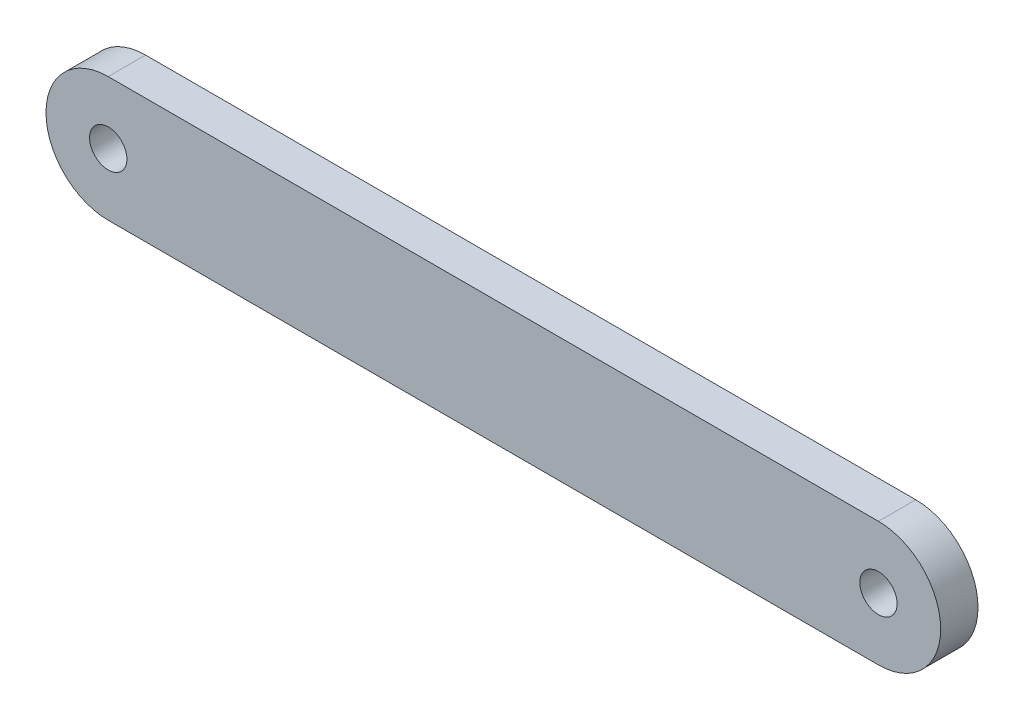
ISO-10303-21;
HEADER;
FILE_DESCRIPTION(('STEP AP214'),'2;1');
FILE_NAME('part.step','',(''),(''),'','','');
FILE_SCHEMA(('AUTOMOTIVE_DESIGN { 1 0 10303 214 1 1 1 1 }'));
ENDSEC;
DATA;
#1=APPLICATION_CONTEXT('core data for automotive mechanical design processes');
#2=APPLICATION_PROTOCOL_DEFINITION('international standard','automotive_design',2000,#1);
#3=PRODUCT_CONTEXT('',#1,'mechanical');
#4=PRODUCT('Part','Part','',(#3));
#5=PRODUCT_RELATED_PRODUCT_CATEGORY('part','',(#4));
#6=PRODUCT_DEFINITION_FORMATION('','',#4);
#7=PRODUCT_DEFINITION_CONTEXT('part definition',#1,'design');
#8=PRODUCT_DEFINITION('design','',#6,#7);
#9=PRODUCT_DEFINITION_SHAPE('','',#8);
#10=(LENGTH_UNIT() NAMED_UNIT(*) SI_UNIT(.MILLI.,.METRE.));
#11=(NAMED_UNIT(*) PLANE_ANGLE_UNIT() SI_UNIT($,.RADIAN.));
#12=(NAMED_UNIT(*) SI_UNIT($,.STERADIAN.) SOLID_ANGLE_UNIT());
#13=UNCERTAINTY_MEASURE_WITH_UNIT(LENGTH_MEASURE(1.E-05),#10,'distance_accuracy_value','');
#14=(GEOMETRIC_REPRESENTATION_CONTEXT(3) GLOBAL_UNCERTAINTY_ASSIGNED_CONTEXT((#13)) GLOBAL_UNIT_ASSIGNED_CONTEXT((#10,
#11,#12)) REPRESENTATION_CONTEXT('',''));
#15=CARTESIAN_POINT('',(0.,0.,0.));
#16=DIRECTION('',(0.,0.,1.));
#17=DIRECTION('',(1.,0.,0.));
#18=AXIS2_PLACEMENT_3D('',#15,#16,#17);
#19=CARTESIAN_POINT('',(0.,0.,3.));
#20=DIRECTION('',(0.,0.,1.));
#21=DIRECTION('',(1.,0.,0.));
#22=AXIS2_PLACEMENT_3D('',#19,#20,#21);
#23=PLANE('',#22);
#24=CARTESIAN_POINT('',(0.,0.,3.));
#25=DIRECTION('',(0.,0.,1.));
#26=DIRECTION('',(1.,0.,0.));
#27=AXIS2_PLACEMENT_3D('',#24,#25,#26);
#28=CIRCLE('',#27,1.5);
#29=CARTESIAN_POINT('',(1.5,0.,3.));
#30=VERTEX_POINT('',#29);
#31=EDGE_CURVE('E106',#30,#30,#28,.T.);
#32=ORIENTED_EDGE('',*,*,#31,.F.);
#33=EDGE_LOOP('',(#32));
#34=FACE_BOUND('',#33,.T.);
#35=CARTESIAN_POINT('',(0.,0.,3.));
#36=DIRECTION('',(0.,0.,1.));
#37=DIRECTION('',(1.,0.,0.));
#38=AXIS2_PLACEMENT_3D('',#35,#36,#37);
#39=CIRCLE('',#38,5.);
#40=CARTESIAN_POINT('',(0.,5.,3.));
#41=VERTEX_POINT('',#40);
#42=CARTESIAN_POINT('',(0.,-5.,3.));
#43=VERTEX_POINT('',#42);
#44=EDGE_CURVE('E91',#41,#43,#39,.T.);
#45=ORIENTED_EDGE('',*,*,#44,.T.);
#46=DIRECTION('',(1.,0.,0.));
#47=VECTOR('',#46,1.);
#48=CARTESIAN_POINT('',(0.,-5.,3.));
#49=LINE('',#48,#47);
#50=CARTESIAN_POINT('',(61.9,-5.,3.));
#51=VERTEX_POINT('',#50);
#52=EDGE_CURVE('E86',#43,#51,#49,.T.);
#53=ORIENTED_EDGE('',*,*,#52,.T.);
#54=CARTESIAN_POINT('',(61.9,0.,3.));
#55=DIRECTION('',(0.,0.,1.));
#56=DIRECTION('',(1.,0.,0.));
#57=AXIS2_PLACEMENT_3D('',#54,#55,#56);
#58=CIRCLE('',#57,5.);
#59=CARTESIAN_POINT('',(61.9,5.,3.));
#60=VERTEX_POINT('',#59);
#61=EDGE_CURVE('E89',#51,#60,#58,.T.);
#62=ORIENTED_EDGE('',*,*,#61,.T.);
#63=DIRECTION('',(-1.,0.,0.));
#64=VECTOR('',#63,1.);
#65=CARTESIAN_POINT('',(0.,5.,3.));
#66=LINE('',#65,#64);
#67=EDGE_CURVE('E56',#60,#41,#66,.T.);
#68=ORIENTED_EDGE('',*,*,#67,.T.);
#69=EDGE_LOOP('',(#45,#53,#62,#68));
#70=FACE_BOUND('',#69,.T.);
#71=CARTESIAN_POINT('',(61.9,0.,3.));
#72=DIRECTION('',(0.,0.,1.));
#73=DIRECTION('',(1.,0.,0.));
#74=AXIS2_PLACEMENT_3D('',#71,#72,#73);
#75=CIRCLE('',#74,1.5);
#76=CARTESIAN_POINT('',(63.4,0.,3.));
#77=VERTEX_POINT('',#76);
#78=EDGE_CURVE('E121',#77,#77,#75,.T.);
#79=ORIENTED_EDGE('',*,*,#78,.F.);
#80=EDGE_LOOP('',(#79));
#81=FACE_BOUND('',#80,.T.);
#82=ADVANCED_FACE('F39',(#34,#70,#81),#23,.T.);
#83=CARTESIAN_POINT('',(0.,0.,0.));
#84=DIRECTION('',(0.,0.,1.));
#85=DIRECTION('',(1.,0.,0.));
#86=AXIS2_PLACEMENT_3D('',#83,#84,#85);
#87=PLANE('',#86);
#88=CARTESIAN_POINT('',(0.,0.,0.));
#89=DIRECTION('',(0.,0.,1.));
#90=DIRECTION('',(1.,0.,0.));
#91=AXIS2_PLACEMENT_3D('',#88,#89,#90);
#92=CIRCLE('',#91,5.);
#93=CARTESIAN_POINT('',(0.,5.,0.));
#94=VERTEX_POINT('',#93);
#95=CARTESIAN_POINT('',(0.,-5.,0.));
#96=VERTEX_POINT('',#95);
#97=EDGE_CURVE('E103',#94,#96,#92,.T.);
#98=ORIENTED_EDGE('',*,*,#97,.F.);
#99=DIRECTION('',(-1.,0.,0.));
#100=VECTOR('',#99,1.);
#101=CARTESIAN_POINT('',(0.,5.,0.));
#102=LINE('',#101,#100);
#103=CARTESIAN_POINT('',(61.9,5.,0.));
#104=VERTEX_POINT('',#103);
#105=EDGE_CURVE('E79',#104,#94,#102,.T.);
#106=ORIENTED_EDGE('',*,*,#105,.F.);
#107=CARTESIAN_POINT('',(61.9,0.,0.));
#108=DIRECTION('',(0.,0.,1.));
#109=DIRECTION('',(1.,0.,0.));
#110=AXIS2_PLACEMENT_3D('',#107,#108,#109);
#111=CIRCLE('',#110,5.);
#112=CARTESIAN_POINT('',(61.9,-5.,0.));
#113=VERTEX_POINT('',#112);
#114=EDGE_CURVE('E73',#113,#104,#111,.T.);
#115=ORIENTED_EDGE('',*,*,#114,.F.);
#116=DIRECTION('',(1.,0.,0.));
#117=VECTOR('',#116,1.);
#118=CARTESIAN_POINT('',(0.,-5.,0.));
#119=LINE('',#118,#117);
#120=EDGE_CURVE('E95',#96,#113,#119,.T.);
#121=ORIENTED_EDGE('',*,*,#120,.F.);
#122=EDGE_LOOP('',(#98,#106,#115,#121));
#123=FACE_BOUND('',#122,.T.);
#124=CARTESIAN_POINT('',(0.,0.,0.));
#125=DIRECTION('',(0.,0.,1.));
#126=DIRECTION('',(1.,0.,0.));
#127=AXIS2_PLACEMENT_3D('',#124,#125,#126);
#128=CIRCLE('',#127,1.5);
#129=CARTESIAN_POINT('',(1.5,0.,0.));
#130=VERTEX_POINT('',#129);
#131=EDGE_CURVE('E118',#130,#130,#128,.T.);
#132=ORIENTED_EDGE('',*,*,#131,.T.);
#133=EDGE_LOOP('',(#132));
#134=FACE_BOUND('',#133,.T.);
#135=CARTESIAN_POINT('',(61.9,0.,0.));
#136=DIRECTION('',(0.,0.,1.));
#137=DIRECTION('',(1.,0.,0.));
#138=AXIS2_PLACEMENT_3D('',#135,#136,#137);
#139=CIRCLE('',#138,1.5);
#140=CARTESIAN_POINT('',(63.4,0.,0.));
#141=VERTEX_POINT('',#140);
#142=EDGE_CURVE('E124',#141,#141,#139,.T.);
#143=ORIENTED_EDGE('',*,*,#142,.T.);
#144=EDGE_LOOP('',(#143));
#145=FACE_BOUND('',#144,.T.);
#146=ADVANCED_FACE('F114',(#123,#134,#145),#87,.F.);
#147=CARTESIAN_POINT('',(0.,0.,3.));
#148=DIRECTION('',(0.,0.,-1.));
#149=DIRECTION('',(-1.,0.,0.));
#150=AXIS2_PLACEMENT_3D('',#147,#148,#149);
#151=CYLINDRICAL_SURFACE('',#150,5.);
#152=ORIENTED_EDGE('',*,*,#97,.T.);
#153=DIRECTION('',(0.,0.,-1.));
#154=VECTOR('',#153,1.);
#155=CARTESIAN_POINT('',(0.,-5.,3.));
#156=LINE('',#155,#154);
#157=EDGE_CURVE('E11',#43,#96,#156,.T.);
#158=ORIENTED_EDGE('',*,*,#157,.F.);
#159=ORIENTED_EDGE('',*,*,#44,.F.);
#160=DIRECTION('',(0.,0.,-1.));
#161=VECTOR('',#160,1.);
#162=CARTESIAN_POINT('',(0.,5.,3.));
#163=LINE('',#162,#161);
#164=EDGE_CURVE('E99',#41,#94,#163,.T.);
#165=ORIENTED_EDGE('',*,*,#164,.T.);
#166=EDGE_LOOP('',(#152,#158,#159,#165));
#167=FACE_BOUND('',#166,.T.);
#168=ADVANCED_FACE('F41',(#167),#151,.T.);
#169=CARTESIAN_POINT('',(0.,-5.,3.));
#170=DIRECTION('',(0.,1.,0.));
#171=DIRECTION('',(0.,0.,1.));
#172=AXIS2_PLACEMENT_3D('',#169,#170,#171);
#173=PLANE('',#172);
#174=ORIENTED_EDGE('',*,*,#120,.T.);
#175=DIRECTION('',(0.,0.,-1.));
#176=VECTOR('',#175,1.);
#177=CARTESIAN_POINT('',(61.9,-5.,3.));
#178=LINE('',#177,#176);
#179=EDGE_CURVE('E48',#51,#113,#178,.T.);
#180=ORIENTED_EDGE('',*,*,#179,.F.);
#181=ORIENTED_EDGE('',*,*,#52,.F.);
#182=ORIENTED_EDGE('',*,*,#157,.T.);
#183=EDGE_LOOP('',(#174,#180,#181,#182));
#184=FACE_BOUND('',#183,.T.);
#185=ADVANCED_FACE('F94',(#184),#173,.F.);
#186=CARTESIAN_POINT('',(61.9,0.,3.));
#187=DIRECTION('',(0.,0.,-1.));
#188=DIRECTION('',(-1.,0.,0.));
#189=AXIS2_PLACEMENT_3D('',#186,#187,#188);
#190=CYLINDRICAL_SURFACE('',#189,5.);
#191=ORIENTED_EDGE('',*,*,#114,.T.);
#192=DIRECTION('',(0.,0.,-1.));
#193=VECTOR('',#192,1.);
#194=CARTESIAN_POINT('',(61.9,5.,3.));
#195=LINE('',#194,#193);
#196=EDGE_CURVE('E96',#60,#104,#195,.T.);
#197=ORIENTED_EDGE('',*,*,#196,.F.);
#198=ORIENTED_EDGE('',*,*,#61,.F.);
#199=ORIENTED_EDGE('',*,*,#179,.T.);
#200=EDGE_LOOP('',(#191,#197,#198,#199));
#201=FACE_BOUND('',#200,.T.);
#202=ADVANCED_FACE('F97',(#201),#190,.T.);
#203=CARTESIAN_POINT('',(0.,5.,3.));
#204=DIRECTION('',(0.,-1.,0.));
#205=DIRECTION('',(0.,0.,-1.));
#206=AXIS2_PLACEMENT_3D('',#203,#204,#205);
#207=PLANE('',#206);
#208=ORIENTED_EDGE('',*,*,#105,.T.);
#209=ORIENTED_EDGE('',*,*,#164,.F.);
#210=ORIENTED_EDGE('',*,*,#67,.F.);
#211=ORIENTED_EDGE('',*,*,#196,.T.);
#212=EDGE_LOOP('',(#208,#209,#210,#211));
#213=FACE_BOUND('',#212,.T.);
#214=ADVANCED_FACE('F111',(#213),#207,.F.);
#215=CARTESIAN_POINT('',(0.,0.,3.));
#216=DIRECTION('',(0.,0.,-1.));
#217=DIRECTION('',(-1.,0.,0.));
#218=AXIS2_PLACEMENT_3D('',#215,#216,#217);
#219=CYLINDRICAL_SURFACE('',#218,1.5);
#220=ORIENTED_EDGE('',*,*,#31,.T.);
#221=EDGE_LOOP('',(#220));
#222=FACE_BOUND('',#221,.T.);
#223=ORIENTED_EDGE('',*,*,#131,.F.);
#224=EDGE_LOOP('',(#223));
#225=FACE_BOUND('',#224,.T.);
#226=ADVANCED_FACE('F141',(#222,#225),#219,.F.);
#227=CARTESIAN_POINT('',(61.9,0.,3.));
#228=DIRECTION('',(0.,0.,-1.));
#229=DIRECTION('',(-1.,0.,0.));
#230=AXIS2_PLACEMENT_3D('',#227,#228,#229);
#231=CYLINDRICAL_SURFACE('',#230,1.5);
#232=ORIENTED_EDGE('',*,*,#78,.T.);
#233=EDGE_LOOP('',(#232));
#234=FACE_BOUND('',#233,.T.);
#235=ORIENTED_EDGE('',*,*,#142,.F.);
#236=EDGE_LOOP('',(#235));
#237=FACE_BOUND('',#236,.T.);
#238=ADVANCED_FACE('F130',(#234,#237),#231,.F.);
#239=CLOSED_SHELL('',(#82,#146,#168,#185,#202,#214,#226,#238));
#240=MANIFOLD_SOLID_BREP('B2',#239);
#241=ADVANCED_BREP_SHAPE_REPRESENTATION('',(#18,#240),#14);
#242=SHAPE_DEFINITION_REPRESENTATION(#9,#241);
ENDSEC;
END-ISO-10303-21;
